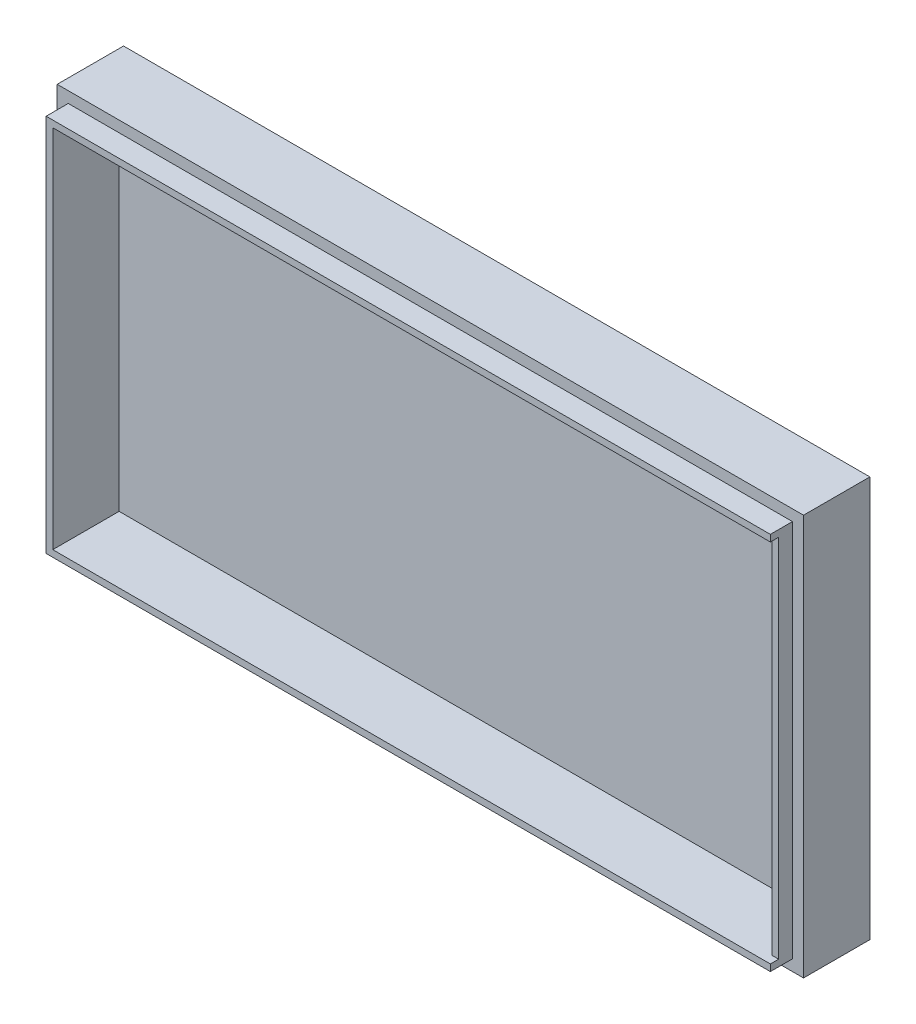
ISO-10303-21;
HEADER;
FILE_DESCRIPTION(('STEP AP214'),'2;1');
FILE_NAME('part.step','',(''),(''),'','','');
FILE_SCHEMA(('AUTOMOTIVE_DESIGN { 1 0 10303 214 1 1 1 1 }'));
ENDSEC;
DATA;
#1=APPLICATION_CONTEXT('core data for automotive mechanical design processes');
#2=APPLICATION_PROTOCOL_DEFINITION('international standard','automotive_design',2000,#1);
#3=PRODUCT_CONTEXT('',#1,'mechanical');
#4=PRODUCT('Part','Part','',(#3));
#5=PRODUCT_RELATED_PRODUCT_CATEGORY('part','',(#4));
#6=PRODUCT_DEFINITION_FORMATION('','',#4);
#7=PRODUCT_DEFINITION_CONTEXT('part definition',#1,'design');
#8=PRODUCT_DEFINITION('design','',#6,#7);
#9=PRODUCT_DEFINITION_SHAPE('','',#8);
#10=(LENGTH_UNIT() NAMED_UNIT(*) SI_UNIT(.MILLI.,.METRE.));
#11=(NAMED_UNIT(*) PLANE_ANGLE_UNIT() SI_UNIT($,.RADIAN.));
#12=(NAMED_UNIT(*) SI_UNIT($,.STERADIAN.) SOLID_ANGLE_UNIT());
#13=UNCERTAINTY_MEASURE_WITH_UNIT(LENGTH_MEASURE(1.E-05),#10,'distance_accuracy_value','');
#14=(GEOMETRIC_REPRESENTATION_CONTEXT(3) GLOBAL_UNCERTAINTY_ASSIGNED_CONTEXT((#13)) GLOBAL_UNIT_ASSIGNED_CONTEXT((#10,
#11,#12)) REPRESENTATION_CONTEXT('',''));
#15=CARTESIAN_POINT('',(0.,0.,0.));
#16=DIRECTION('',(0.,0.,1.));
#17=DIRECTION('',(1.,0.,0.));
#18=AXIS2_PLACEMENT_3D('',#15,#16,#17);
#19=CARTESIAN_POINT('',(-4.8169014084507,4.16197183098592,12.));
#20=DIRECTION('',(1.,0.,0.));
#21=DIRECTION('',(0.,1.,0.));
#22=AXIS2_PLACEMENT_3D('',#19,#20,#21);
#23=PLANE('',#22);
#24=DIRECTION('',(0.,-1.,0.));
#25=VECTOR('',#24,1.);
#26=CARTESIAN_POINT('',(-4.8169014084507,4.16197183098592,0.));
#27=LINE('',#26,#25);
#28=CARTESIAN_POINT('',(-4.8169014084507,4.16197183098592,0.));
#29=VERTEX_POINT('',#28);
#30=CARTESIAN_POINT('',(-4.81690140845069,-68.3380281690141,0.));
#31=VERTEX_POINT('',#30);
#32=EDGE_CURVE('E208',#29,#31,#27,.T.);
#33=ORIENTED_EDGE('',*,*,#32,.T.);
#34=DIRECTION('',(0.,0.,-1.));
#35=VECTOR('',#34,1.);
#36=CARTESIAN_POINT('',(-4.81690140845069,-68.3380281690141,12.));
#37=LINE('',#36,#35);
#38=CARTESIAN_POINT('',(-4.81690140845069,-68.3380281690141,12.));
#39=VERTEX_POINT('',#38);
#40=EDGE_CURVE('E11',#39,#31,#37,.T.);
#41=ORIENTED_EDGE('',*,*,#40,.F.);
#42=DIRECTION('',(0.,-1.,0.));
#43=VECTOR('',#42,1.);
#44=CARTESIAN_POINT('',(-4.8169014084507,4.16197183098592,12.));
#45=LINE('',#44,#43);
#46=CARTESIAN_POINT('',(-4.8169014084507,4.16197183098592,12.));
#47=VERTEX_POINT('',#46);
#48=EDGE_CURVE('E209',#47,#39,#45,.T.);
#49=ORIENTED_EDGE('',*,*,#48,.F.);
#50=DIRECTION('',(0.,0.,-1.));
#51=VECTOR('',#50,1.);
#52=CARTESIAN_POINT('',(-4.8169014084507,4.16197183098592,12.));
#53=LINE('',#52,#51);
#54=EDGE_CURVE('E223',#47,#29,#53,.T.);
#55=ORIENTED_EDGE('',*,*,#54,.T.);
#56=EDGE_LOOP('',(#33,#41,#49,#55));
#57=FACE_BOUND('',#56,.T.);
#58=ADVANCED_FACE('F38',(#57),#23,.F.);
#59=CARTESIAN_POINT('',(-4.81690140845069,-68.3380281690141,12.));
#60=DIRECTION('',(0.,1.,0.));
#61=DIRECTION('',(0.,0.,1.));
#62=AXIS2_PLACEMENT_3D('',#59,#60,#61);
#63=PLANE('',#62);
#64=DIRECTION('',(1.,0.,0.));
#65=VECTOR('',#64,1.);
#66=CARTESIAN_POINT('',(-4.81690140845069,-68.3380281690141,0.));
#67=LINE('',#66,#65);
#68=CARTESIAN_POINT('',(130.183098591549,-68.3380281690141,0.));
#69=VERTEX_POINT('',#68);
#70=EDGE_CURVE('E227',#31,#69,#67,.T.);
#71=ORIENTED_EDGE('',*,*,#70,.T.);
#72=DIRECTION('',(0.,0.,-1.));
#73=VECTOR('',#72,1.);
#74=CARTESIAN_POINT('',(130.183098591549,-68.3380281690141,12.));
#75=LINE('',#74,#73);
#76=CARTESIAN_POINT('',(130.183098591549,-68.3380281690141,12.));
#77=VERTEX_POINT('',#76);
#78=EDGE_CURVE('E46',#77,#69,#75,.T.);
#79=ORIENTED_EDGE('',*,*,#78,.F.);
#80=DIRECTION('',(1.,0.,0.));
#81=VECTOR('',#80,1.);
#82=CARTESIAN_POINT('',(-4.81690140845069,-68.3380281690141,12.));
#83=LINE('',#82,#81);
#84=EDGE_CURVE('E213',#39,#77,#83,.T.);
#85=ORIENTED_EDGE('',*,*,#84,.F.);
#86=ORIENTED_EDGE('',*,*,#40,.T.);
#87=EDGE_LOOP('',(#71,#79,#85,#86));
#88=FACE_BOUND('',#87,.T.);
#89=ADVANCED_FACE('F263',(#88),#63,.F.);
#90=CARTESIAN_POINT('',(130.183098591549,4.16197183098592,12.));
#91=DIRECTION('',(-1.,0.,0.));
#92=DIRECTION('',(0.,0.,1.));
#93=AXIS2_PLACEMENT_3D('',#90,#91,#92);
#94=PLANE('',#93);
#95=DIRECTION('',(0.,1.,0.));
#96=VECTOR('',#95,1.);
#97=CARTESIAN_POINT('',(130.183098591549,4.16197183098592,0.));
#98=LINE('',#97,#96);
#99=CARTESIAN_POINT('',(130.183098591549,4.16197183098592,0.));
#100=VERTEX_POINT('',#99);
#101=EDGE_CURVE('E230',#69,#100,#98,.T.);
#102=ORIENTED_EDGE('',*,*,#101,.T.);
#103=DIRECTION('',(0.,0.,-1.));
#104=VECTOR('',#103,1.);
#105=CARTESIAN_POINT('',(130.183098591549,4.16197183098592,12.));
#106=LINE('',#105,#104);
#107=CARTESIAN_POINT('',(130.183098591549,4.16197183098592,12.));
#108=VERTEX_POINT('',#107);
#109=EDGE_CURVE('E238',#108,#100,#106,.T.);
#110=ORIENTED_EDGE('',*,*,#109,.F.);
#111=DIRECTION('',(0.,1.,0.));
#112=VECTOR('',#111,1.);
#113=CARTESIAN_POINT('',(130.183098591549,4.16197183098592,12.));
#114=LINE('',#113,#112);
#115=EDGE_CURVE('E217',#77,#108,#114,.T.);
#116=ORIENTED_EDGE('',*,*,#115,.F.);
#117=ORIENTED_EDGE('',*,*,#78,.T.);
#118=EDGE_LOOP('',(#102,#110,#116,#117));
#119=FACE_BOUND('',#118,.T.);
#120=ADVANCED_FACE('F247',(#119),#94,.F.);
#121=CARTESIAN_POINT('',(-4.8169014084507,4.16197183098592,12.));
#122=DIRECTION('',(0.,-1.,0.));
#123=DIRECTION('',(0.,0.,-1.));
#124=AXIS2_PLACEMENT_3D('',#121,#122,#123);
#125=PLANE('',#124);
#126=DIRECTION('',(-1.,0.,0.));
#127=VECTOR('',#126,1.);
#128=CARTESIAN_POINT('',(-4.8169014084507,4.16197183098592,0.));
#129=LINE('',#128,#127);
#130=EDGE_CURVE('E214',#100,#29,#129,.T.);
#131=ORIENTED_EDGE('',*,*,#130,.T.);
#132=ORIENTED_EDGE('',*,*,#54,.F.);
#133=DIRECTION('',(-1.,0.,0.));
#134=VECTOR('',#133,1.);
#135=CARTESIAN_POINT('',(-4.8169014084507,4.16197183098592,12.));
#136=LINE('',#135,#134);
#137=EDGE_CURVE('E220',#108,#47,#136,.T.);
#138=ORIENTED_EDGE('',*,*,#137,.F.);
#139=ORIENTED_EDGE('',*,*,#109,.T.);
#140=EDGE_LOOP('',(#131,#132,#138,#139));
#141=FACE_BOUND('',#140,.T.);
#142=ADVANCED_FACE('F256',(#141),#125,.F.);
#143=CARTESIAN_POINT('',(0.,0.,12.));
#144=DIRECTION('',(0.,0.,1.));
#145=DIRECTION('',(1.,0.,0.));
#146=AXIS2_PLACEMENT_3D('',#143,#144,#145);
#147=PLANE('',#146);
#148=DIRECTION('',(0.,-1.,0.));
#149=VECTOR('',#148,1.);
#150=CARTESIAN_POINT('',(-2.8169014084507,2.16197183098592,12.));
#151=LINE('',#150,#149);
#152=CARTESIAN_POINT('',(-2.8169014084507,2.16197183098592,12.));
#153=VERTEX_POINT('',#152);
#154=CARTESIAN_POINT('',(-2.81690140845069,-66.3380281690141,12.));
#155=VERTEX_POINT('',#154);
#156=EDGE_CURVE('E176',#153,#155,#151,.T.);
#157=ORIENTED_EDGE('',*,*,#156,.F.);
#158=DIRECTION('',(-1.,0.,0.));
#159=VECTOR('',#158,1.);
#160=CARTESIAN_POINT('',(-2.8169014084507,2.16197183098592,12.));
#161=LINE('',#160,#159);
#162=CARTESIAN_POINT('',(128.183098591549,2.16197183098592,12.));
#163=VERTEX_POINT('',#162);
#164=EDGE_CURVE('E189',#163,#153,#161,.T.);
#165=ORIENTED_EDGE('',*,*,#164,.F.);
#166=DIRECTION('',(0.,1.,0.));
#167=VECTOR('',#166,1.);
#168=CARTESIAN_POINT('',(128.183098591549,2.16197183098592,12.));
#169=LINE('',#168,#167);
#170=CARTESIAN_POINT('',(128.183098591549,-66.3380281690141,12.));
#171=VERTEX_POINT('',#170);
#172=EDGE_CURVE('E185',#171,#163,#169,.T.);
#173=ORIENTED_EDGE('',*,*,#172,.F.);
#174=DIRECTION('',(1.,0.,0.));
#175=VECTOR('',#174,1.);
#176=CARTESIAN_POINT('',(-2.81690140845069,-66.3380281690141,12.));
#177=LINE('',#176,#175);
#178=EDGE_CURVE('E180',#155,#171,#177,.T.);
#179=ORIENTED_EDGE('',*,*,#178,.F.);
#180=EDGE_LOOP('',(#157,#165,#173,#179));
#181=FACE_BOUND('',#180,.T.);
#182=ORIENTED_EDGE('',*,*,#48,.T.);
#183=ORIENTED_EDGE('',*,*,#84,.T.);
#184=ORIENTED_EDGE('',*,*,#115,.T.);
#185=ORIENTED_EDGE('',*,*,#137,.T.);
#186=EDGE_LOOP('',(#182,#183,#184,#185));
#187=FACE_BOUND('',#186,.T.);
#188=ADVANCED_FACE('F262',(#181,#187),#147,.T.);
#189=CARTESIAN_POINT('',(0.,0.,0.));
#190=DIRECTION('',(0.,0.,1.));
#191=DIRECTION('',(1.,0.,0.));
#192=AXIS2_PLACEMENT_3D('',#189,#190,#191);
#193=PLANE('',#192);
#194=ORIENTED_EDGE('',*,*,#32,.F.);
#195=ORIENTED_EDGE('',*,*,#130,.F.);
#196=ORIENTED_EDGE('',*,*,#101,.F.);
#197=ORIENTED_EDGE('',*,*,#70,.F.);
#198=EDGE_LOOP('',(#194,#195,#196,#197));
#199=FACE_BOUND('',#198,.T.);
#200=ADVANCED_FACE('F253',(#199),#193,.F.);
#201=CARTESIAN_POINT('',(-2.8169014084507,2.16197183098592,16.));
#202=DIRECTION('',(1.,0.,0.));
#203=DIRECTION('',(0.,1.,0.));
#204=AXIS2_PLACEMENT_3D('',#201,#202,#203);
#205=PLANE('',#204);
#206=ORIENTED_EDGE('',*,*,#156,.T.);
#207=DIRECTION('',(0.,0.,-1.));
#208=VECTOR('',#207,1.);
#209=CARTESIAN_POINT('',(-2.81690140845069,-66.3380281690141,16.));
#210=LINE('',#209,#208);
#211=CARTESIAN_POINT('',(-2.81690140845069,-66.3380281690141,16.));
#212=VERTEX_POINT('',#211);
#213=EDGE_CURVE('E204',#212,#155,#210,.T.);
#214=ORIENTED_EDGE('',*,*,#213,.F.);
#215=DIRECTION('',(0.,-1.,0.));
#216=VECTOR('',#215,1.);
#217=CARTESIAN_POINT('',(-2.8169014084507,2.16197183098592,16.));
#218=LINE('',#217,#216);
#219=CARTESIAN_POINT('',(-2.8169014084507,2.16197183098592,16.));
#220=VERTEX_POINT('',#219);
#221=EDGE_CURVE('E193',#220,#212,#218,.T.);
#222=ORIENTED_EDGE('',*,*,#221,.F.);
#223=DIRECTION('',(0.,0.,-1.));
#224=VECTOR('',#223,1.);
#225=CARTESIAN_POINT('',(-2.8169014084507,2.16197183098592,16.));
#226=LINE('',#225,#224);
#227=EDGE_CURVE('E171',#220,#153,#226,.T.);
#228=ORIENTED_EDGE('',*,*,#227,.T.);
#229=EDGE_LOOP('',(#206,#214,#222,#228));
#230=FACE_BOUND('',#229,.T.);
#231=ADVANCED_FACE('F275',(#230),#205,.F.);
#232=CARTESIAN_POINT('',(-2.81690140845069,-66.3380281690141,16.));
#233=DIRECTION('',(0.,1.,0.));
#234=DIRECTION('',(0.,0.,1.));
#235=AXIS2_PLACEMENT_3D('',#232,#233,#234);
#236=PLANE('',#235);
#237=ORIENTED_EDGE('',*,*,#178,.T.);
#238=DIRECTION('',(0.,0.,-1.));
#239=VECTOR('',#238,1.);
#240=CARTESIAN_POINT('',(128.183098591549,-66.3380281690141,16.));
#241=LINE('',#240,#239);
#242=CARTESIAN_POINT('',(128.183098591549,-66.3380281690141,16.));
#243=VERTEX_POINT('',#242);
#244=EDGE_CURVE('E201',#243,#171,#241,.T.);
#245=ORIENTED_EDGE('',*,*,#244,.F.);
#246=DIRECTION('',(1.,0.,0.));
#247=VECTOR('',#246,1.);
#248=CARTESIAN_POINT('',(-2.81690140845069,-66.3380281690141,16.));
#249=LINE('',#248,#247);
#250=EDGE_CURVE('E163',#212,#243,#249,.T.);
#251=ORIENTED_EDGE('',*,*,#250,.F.);
#252=ORIENTED_EDGE('',*,*,#213,.T.);
#253=EDGE_LOOP('',(#237,#245,#251,#252));
#254=FACE_BOUND('',#253,.T.);
#255=ADVANCED_FACE('F281',(#254),#236,.F.);
#256=CARTESIAN_POINT('',(128.183098591549,2.16197183098592,16.));
#257=DIRECTION('',(-1.,0.,0.));
#258=DIRECTION('',(0.,0.,1.));
#259=AXIS2_PLACEMENT_3D('',#256,#257,#258);
#260=PLANE('',#259);
#261=DIRECTION('',(0.,1.,0.));
#262=VECTOR('',#261,1.);
#263=CARTESIAN_POINT('',(128.183098591549,2.16197183098592,16.));
#264=LINE('',#263,#262);
#265=CARTESIAN_POINT('',(128.183098591549,0.961971830985911,16.));
#266=VERTEX_POINT('',#265);
#267=CARTESIAN_POINT('',(128.183098591549,2.16197183098592,16.));
#268=VERTEX_POINT('',#267);
#269=EDGE_CURVE('E167',#266,#268,#264,.T.);
#270=ORIENTED_EDGE('',*,*,#269,.F.);
#271=DIRECTION('',(0.,0.,1.));
#272=VECTOR('',#271,1.);
#273=CARTESIAN_POINT('',(128.183098591549,0.961971830985911,16.));
#274=LINE('',#273,#272);
#275=CARTESIAN_POINT('',(128.183098591549,0.961971830985917,14.5));
#276=VERTEX_POINT('',#275);
#277=EDGE_CURVE('E321',#276,#266,#274,.T.);
#278=ORIENTED_EDGE('',*,*,#277,.F.);
#279=DIRECTION('',(0.,1.,0.));
#280=VECTOR('',#279,1.);
#281=CARTESIAN_POINT('',(128.183098591549,0.961971830985917,14.5));
#282=LINE('',#281,#280);
#283=CARTESIAN_POINT('',(128.183098591549,-65.1380281690141,14.5));
#284=VERTEX_POINT('',#283);
#285=EDGE_CURVE('E158',#284,#276,#282,.T.);
#286=ORIENTED_EDGE('',*,*,#285,.F.);
#287=DIRECTION('',(0.,0.,-1.));
#288=VECTOR('',#287,1.);
#289=CARTESIAN_POINT('',(128.183098591549,-65.1380281690141,16.));
#290=LINE('',#289,#288);
#291=CARTESIAN_POINT('',(128.183098591549,-65.1380281690141,16.));
#292=VERTEX_POINT('',#291);
#293=EDGE_CURVE('E141',#292,#284,#290,.T.);
#294=ORIENTED_EDGE('',*,*,#293,.F.);
#295=EDGE_CURVE('E155',#243,#292,#264,.T.);
#296=ORIENTED_EDGE('',*,*,#295,.F.);
#297=ORIENTED_EDGE('',*,*,#244,.T.);
#298=ORIENTED_EDGE('',*,*,#172,.T.);
#299=DIRECTION('',(0.,0.,-1.));
#300=VECTOR('',#299,1.);
#301=CARTESIAN_POINT('',(128.183098591549,2.16197183098592,16.));
#302=LINE('',#301,#300);
#303=EDGE_CURVE('E197',#268,#163,#302,.T.);
#304=ORIENTED_EDGE('',*,*,#303,.F.);
#305=EDGE_LOOP('',(#270,#278,#286,#294,#296,#297,#298,#304));
#306=FACE_BOUND('',#305,.T.);
#307=ADVANCED_FACE('F153',(#306),#260,.F.);
#308=CARTESIAN_POINT('',(-2.8169014084507,2.16197183098592,16.));
#309=DIRECTION('',(0.,-1.,0.));
#310=DIRECTION('',(0.,0.,-1.));
#311=AXIS2_PLACEMENT_3D('',#308,#309,#310);
#312=PLANE('',#311);
#313=ORIENTED_EDGE('',*,*,#164,.T.);
#314=ORIENTED_EDGE('',*,*,#227,.F.);
#315=DIRECTION('',(-1.,0.,0.));
#316=VECTOR('',#315,1.);
#317=CARTESIAN_POINT('',(-2.8169014084507,2.16197183098592,16.));
#318=LINE('',#317,#316);
#319=EDGE_CURVE('E166',#268,#220,#318,.T.);
#320=ORIENTED_EDGE('',*,*,#319,.F.);
#321=ORIENTED_EDGE('',*,*,#303,.T.);
#322=EDGE_LOOP('',(#313,#314,#320,#321));
#323=FACE_BOUND('',#322,.T.);
#324=ADVANCED_FACE('F288',(#323),#312,.F.);
#325=CARTESIAN_POINT('',(0.,0.,16.));
#326=DIRECTION('',(0.,0.,1.));
#327=DIRECTION('',(1.,0.,0.));
#328=AXIS2_PLACEMENT_3D('',#325,#326,#327);
#329=PLANE('',#328);
#330=DIRECTION('',(-1.,0.,0.));
#331=VECTOR('',#330,1.);
#332=CARTESIAN_POINT('',(-1.6169014084507,0.961971830985917,16.));
#333=LINE('',#332,#331);
#334=CARTESIAN_POINT('',(-1.6169014084507,0.961971830985917,16.));
#335=VERTEX_POINT('',#334);
#336=EDGE_CURVE('E148',#266,#335,#333,.T.);
#337=ORIENTED_EDGE('',*,*,#336,.F.);
#338=ORIENTED_EDGE('',*,*,#269,.T.);
#339=ORIENTED_EDGE('',*,*,#319,.T.);
#340=ORIENTED_EDGE('',*,*,#221,.T.);
#341=ORIENTED_EDGE('',*,*,#250,.T.);
#342=ORIENTED_EDGE('',*,*,#295,.T.);
#343=DIRECTION('',(1.,0.,0.));
#344=VECTOR('',#343,1.);
#345=CARTESIAN_POINT('',(-1.61690140845069,-65.1380281690141,16.));
#346=LINE('',#345,#344);
#347=CARTESIAN_POINT('',(-1.61690140845069,-65.1380281690141,16.));
#348=VERTEX_POINT('',#347);
#349=EDGE_CURVE('E138',#348,#292,#346,.T.);
#350=ORIENTED_EDGE('',*,*,#349,.F.);
#351=DIRECTION('',(0.,-1.,0.));
#352=VECTOR('',#351,1.);
#353=CARTESIAN_POINT('',(-1.6169014084507,0.961971830985917,16.));
#354=LINE('',#353,#352);
#355=EDGE_CURVE('E61',#335,#348,#354,.T.);
#356=ORIENTED_EDGE('',*,*,#355,.F.);
#357=EDGE_LOOP('',(#337,#338,#339,#340,#341,#342,#350,#356));
#358=FACE_BOUND('',#357,.T.);
#359=ADVANCED_FACE('F161',(#358),#329,.T.);
#360=CARTESIAN_POINT('',(-1.6169014084507,0.961971830985917,-132.593118785093));
#361=DIRECTION('',(-1.,0.,0.));
#362=DIRECTION('',(0.,-1.,0.));
#363=AXIS2_PLACEMENT_3D('',#360,#361,#362);
#364=PLANE('',#363);
#365=DIRECTION('',(0.,0.,1.));
#366=VECTOR('',#365,1.);
#367=CARTESIAN_POINT('',(-1.61690140845069,-65.1380281690141,-132.593118785093));
#368=LINE('',#367,#366);
#369=CARTESIAN_POINT('',(-1.6169014084507,-65.1380281690141,4.));
#370=VERTEX_POINT('',#369);
#371=EDGE_CURVE('E144',#370,#348,#368,.T.);
#372=ORIENTED_EDGE('',*,*,#371,.F.);
#373=DIRECTION('',(0.,-1.,0.));
#374=VECTOR('',#373,1.);
#375=CARTESIAN_POINT('',(-1.6169014084507,0.961971830985917,4.));
#376=LINE('',#375,#374);
#377=CARTESIAN_POINT('',(-1.6169014084507,0.961971830985917,4.));
#378=VERTEX_POINT('',#377);
#379=EDGE_CURVE('E331',#378,#370,#376,.T.);
#380=ORIENTED_EDGE('',*,*,#379,.F.);
#381=DIRECTION('',(0.,0.,1.));
#382=VECTOR('',#381,1.);
#383=CARTESIAN_POINT('',(-1.6169014084507,0.961971830985917,-132.593118785093));
#384=LINE('',#383,#382);
#385=EDGE_CURVE('E181',#378,#335,#384,.T.);
#386=ORIENTED_EDGE('',*,*,#385,.T.);
#387=ORIENTED_EDGE('',*,*,#355,.T.);
#388=EDGE_LOOP('',(#372,#380,#386,#387));
#389=FACE_BOUND('',#388,.T.);
#390=ADVANCED_FACE('F294',(#389),#364,.F.);
#391=CARTESIAN_POINT('',(-1.6169014084507,0.961971830985917,-132.593118785093));
#392=DIRECTION('',(0.,1.,0.));
#393=DIRECTION('',(0.,0.,1.));
#394=AXIS2_PLACEMENT_3D('',#391,#392,#393);
#395=PLANE('',#394);
#396=DIRECTION('',(0.,0.,1.));
#397=VECTOR('',#396,1.);
#398=CARTESIAN_POINT('',(126.983098591549,0.961971830985917,-132.593118785093));
#399=LINE('',#398,#397);
#400=CARTESIAN_POINT('',(126.983098591549,0.961971830985917,4.));
#401=VERTEX_POINT('',#400);
#402=CARTESIAN_POINT('',(126.983098591549,0.961971830985917,14.5));
#403=VERTEX_POINT('',#402);
#404=EDGE_CURVE('E353',#401,#403,#399,.T.);
#405=ORIENTED_EDGE('',*,*,#404,.T.);
#406=DIRECTION('',(1.,0.,0.));
#407=VECTOR('',#406,1.);
#408=CARTESIAN_POINT('',(118.183098591549,0.961971830985917,14.5));
#409=LINE('',#408,#407);
#410=EDGE_CURVE('E320',#403,#276,#409,.T.);
#411=ORIENTED_EDGE('',*,*,#410,.T.);
#412=ORIENTED_EDGE('',*,*,#277,.T.);
#413=ORIENTED_EDGE('',*,*,#336,.T.);
#414=ORIENTED_EDGE('',*,*,#385,.F.);
#415=DIRECTION('',(-1.,0.,0.));
#416=VECTOR('',#415,1.);
#417=CARTESIAN_POINT('',(-1.6169014084507,0.961971830985917,4.));
#418=LINE('',#417,#416);
#419=EDGE_CURVE('E343',#401,#378,#418,.T.);
#420=ORIENTED_EDGE('',*,*,#419,.F.);
#421=EDGE_LOOP('',(#405,#411,#412,#413,#414,#420));
#422=FACE_BOUND('',#421,.T.);
#423=ADVANCED_FACE('F297',(#422),#395,.F.);
#424=CARTESIAN_POINT('',(126.983098591549,0.961971830985917,-132.593118785093));
#425=DIRECTION('',(1.,0.,0.));
#426=DIRECTION('',(0.,0.,-1.));
#427=AXIS2_PLACEMENT_3D('',#424,#425,#426);
#428=PLANE('',#427);
#429=DIRECTION('',(0.,0.,1.));
#430=VECTOR('',#429,1.);
#431=CARTESIAN_POINT('',(126.983098591549,-65.1380281690141,-132.593118785093));
#432=LINE('',#431,#430);
#433=CARTESIAN_POINT('',(126.983098591549,-65.1380281690141,4.));
#434=VERTEX_POINT('',#433);
#435=CARTESIAN_POINT('',(126.983098591549,-65.1380281690141,14.5));
#436=VERTEX_POINT('',#435);
#437=EDGE_CURVE('E357',#434,#436,#432,.T.);
#438=ORIENTED_EDGE('',*,*,#437,.T.);
#439=DIRECTION('',(0.,1.,0.));
#440=VECTOR('',#439,1.);
#441=CARTESIAN_POINT('',(126.983098591549,0.961971830985898,14.5));
#442=LINE('',#441,#440);
#443=EDGE_CURVE('E317',#436,#403,#442,.T.);
#444=ORIENTED_EDGE('',*,*,#443,.T.);
#445=ORIENTED_EDGE('',*,*,#404,.F.);
#446=DIRECTION('',(0.,1.,0.));
#447=VECTOR('',#446,1.);
#448=CARTESIAN_POINT('',(126.983098591549,0.961971830985917,4.));
#449=LINE('',#448,#447);
#450=EDGE_CURVE('E339',#434,#401,#449,.T.);
#451=ORIENTED_EDGE('',*,*,#450,.F.);
#452=EDGE_LOOP('',(#438,#444,#445,#451));
#453=FACE_BOUND('',#452,.T.);
#454=ADVANCED_FACE('F301',(#453),#428,.F.);
#455=CARTESIAN_POINT('',(-1.61690140845069,-65.1380281690141,-132.593118785093));
#456=DIRECTION('',(0.,-1.,0.));
#457=DIRECTION('',(0.,0.,-1.));
#458=AXIS2_PLACEMENT_3D('',#455,#456,#457);
#459=PLANE('',#458);
#460=ORIENTED_EDGE('',*,*,#349,.T.);
#461=ORIENTED_EDGE('',*,*,#293,.T.);
#462=DIRECTION('',(1.,0.,0.));
#463=VECTOR('',#462,1.);
#464=CARTESIAN_POINT('',(118.183098591549,-65.1380281690141,14.5));
#465=LINE('',#464,#463);
#466=EDGE_CURVE('E53',#436,#284,#465,.T.);
#467=ORIENTED_EDGE('',*,*,#466,.F.);
#468=ORIENTED_EDGE('',*,*,#437,.F.);
#469=DIRECTION('',(1.,0.,0.));
#470=VECTOR('',#469,1.);
#471=CARTESIAN_POINT('',(-1.6169014084507,-65.1380281690141,4.));
#472=LINE('',#471,#470);
#473=EDGE_CURVE('E335',#370,#434,#472,.T.);
#474=ORIENTED_EDGE('',*,*,#473,.F.);
#475=ORIENTED_EDGE('',*,*,#371,.T.);
#476=EDGE_LOOP('',(#460,#461,#467,#468,#474,#475));
#477=FACE_BOUND('',#476,.T.);
#478=ADVANCED_FACE('F140',(#477),#459,.F.);
#479=CARTESIAN_POINT('',(0.,0.,4.));
#480=DIRECTION('',(0.,0.,1.));
#481=DIRECTION('',(1.,0.,0.));
#482=AXIS2_PLACEMENT_3D('',#479,#480,#481);
#483=PLANE('',#482);
#484=ORIENTED_EDGE('',*,*,#379,.T.);
#485=ORIENTED_EDGE('',*,*,#473,.T.);
#486=ORIENTED_EDGE('',*,*,#450,.T.);
#487=ORIENTED_EDGE('',*,*,#419,.T.);
#488=EDGE_LOOP('',(#484,#485,#486,#487));
#489=FACE_BOUND('',#488,.T.);
#490=ADVANCED_FACE('F300',(#489),#483,.T.);
#491=CARTESIAN_POINT('',(118.183098591549,0.961971830985917,14.5));
#492=DIRECTION('',(0.,0.,-1.));
#493=DIRECTION('',(0.,1.,0.));
#494=AXIS2_PLACEMENT_3D('',#491,#492,#493);
#495=PLANE('',#494);
#496=ORIENTED_EDGE('',*,*,#466,.T.);
#497=ORIENTED_EDGE('',*,*,#285,.T.);
#498=ORIENTED_EDGE('',*,*,#410,.F.);
#499=ORIENTED_EDGE('',*,*,#443,.F.);
#500=EDGE_LOOP('',(#496,#497,#498,#499));
#501=FACE_BOUND('',#500,.T.);
#502=ADVANCED_FACE('F310',(#501),#495,.F.);
#503=CLOSED_SHELL('',(#58,#89,#120,#142,#188,#200,#231,#255,#307,#324,#359,#390,#423,#454,#478,
#490,#502));
#504=MANIFOLD_SOLID_BREP('B2',#503);
#505=ADVANCED_BREP_SHAPE_REPRESENTATION('',(#18,#504),#14);
#506=SHAPE_DEFINITION_REPRESENTATION(#9,#505);
ENDSEC;
END-ISO-10303-21;
